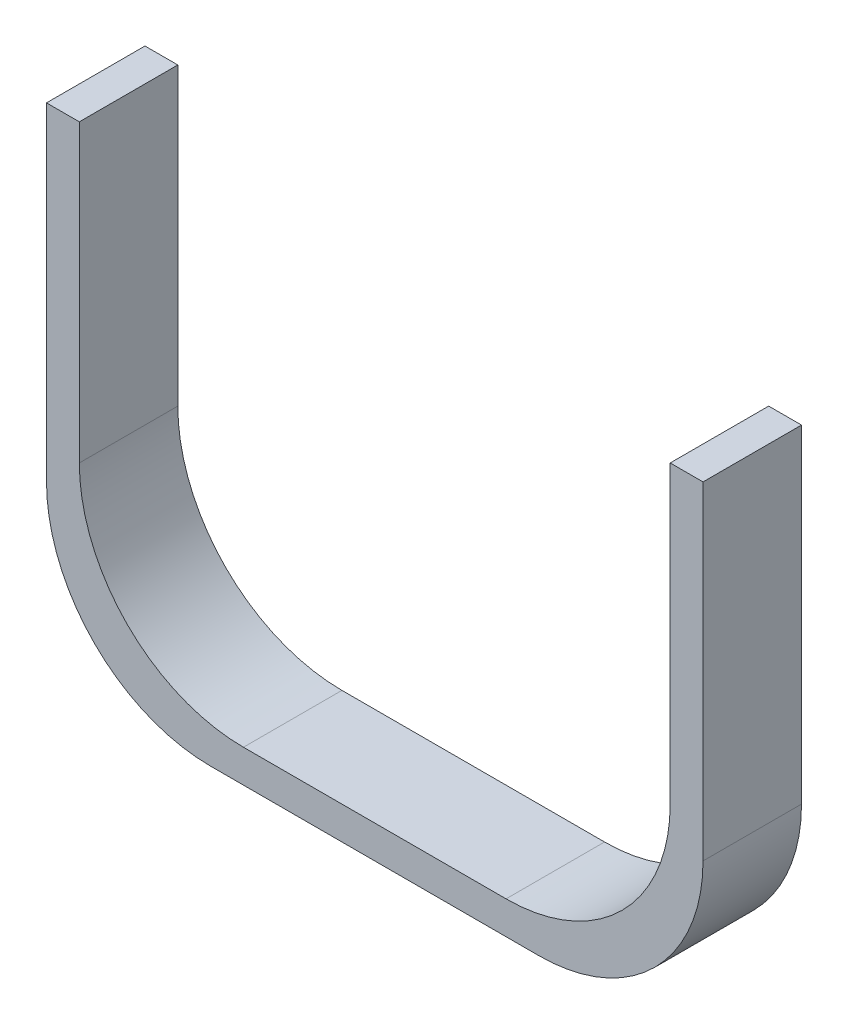
ISO-10303-21;
HEADER;
FILE_DESCRIPTION(('STEP AP214'),'2;1');
FILE_NAME('part.step','',(''),(''),'','','');
FILE_SCHEMA(('AUTOMOTIVE_DESIGN { 1 0 10303 214 1 1 1 1 }'));
ENDSEC;
DATA;
#1=APPLICATION_CONTEXT('core data for automotive mechanical design processes');
#2=APPLICATION_PROTOCOL_DEFINITION('international standard','automotive_design',2000,#1);
#3=PRODUCT_CONTEXT('',#1,'mechanical');
#4=PRODUCT('Part','Part','',(#3));
#5=PRODUCT_RELATED_PRODUCT_CATEGORY('part','',(#4));
#6=PRODUCT_DEFINITION_FORMATION('','',#4);
#7=PRODUCT_DEFINITION_CONTEXT('part definition',#1,'design');
#8=PRODUCT_DEFINITION('design','',#6,#7);
#9=PRODUCT_DEFINITION_SHAPE('','',#8);
#10=(LENGTH_UNIT() NAMED_UNIT(*) SI_UNIT(.MILLI.,.METRE.));
#11=(NAMED_UNIT(*) PLANE_ANGLE_UNIT() SI_UNIT($,.RADIAN.));
#12=(NAMED_UNIT(*) SI_UNIT($,.STERADIAN.) SOLID_ANGLE_UNIT());
#13=UNCERTAINTY_MEASURE_WITH_UNIT(LENGTH_MEASURE(1.E-05),#10,'distance_accuracy_value','');
#14=(GEOMETRIC_REPRESENTATION_CONTEXT(3) GLOBAL_UNCERTAINTY_ASSIGNED_CONTEXT((#13)) GLOBAL_UNIT_ASSIGNED_CONTEXT((#10,
#11,#12)) REPRESENTATION_CONTEXT('',''));
#15=CARTESIAN_POINT('',(0.,0.,0.));
#16=DIRECTION('',(0.,0.,1.));
#17=DIRECTION('',(1.,0.,0.));
#18=AXIS2_PLACEMENT_3D('',#15,#16,#17);
#19=CARTESIAN_POINT('',(0.,150.,30.));
#20=DIRECTION('',(1.,0.,0.));
#21=DIRECTION('',(0.,1.,0.));
#22=AXIS2_PLACEMENT_3D('',#19,#20,#21);
#23=PLANE('',#22);
#24=DIRECTION('',(0.,-1.,0.));
#25=VECTOR('',#24,1.);
#26=CARTESIAN_POINT('',(0.,150.,0.));
#27=LINE('',#26,#25);
#28=CARTESIAN_POINT('',(0.,150.,0.));
#29=VERTEX_POINT('',#28);
#30=CARTESIAN_POINT('',(0.,50.,0.));
#31=VERTEX_POINT('',#30);
#32=EDGE_CURVE('E165',#29,#31,#27,.T.);
#33=ORIENTED_EDGE('',*,*,#32,.T.);
#34=DIRECTION('',(0.,0.,-1.));
#35=VECTOR('',#34,1.);
#36=CARTESIAN_POINT('',(0.,50.,30.));
#37=LINE('',#36,#35);
#38=CARTESIAN_POINT('',(0.,50.,30.));
#39=VERTEX_POINT('',#38);
#40=EDGE_CURVE('E11',#31,#39,#37,.F.);
#41=ORIENTED_EDGE('',*,*,#40,.T.);
#42=DIRECTION('',(0.,-1.,0.));
#43=VECTOR('',#42,1.);
#44=CARTESIAN_POINT('',(0.,150.,30.));
#45=LINE('',#44,#43);
#46=CARTESIAN_POINT('',(0.,150.,30.));
#47=VERTEX_POINT('',#46);
#48=EDGE_CURVE('E182',#47,#39,#45,.T.);
#49=ORIENTED_EDGE('',*,*,#48,.F.);
#50=DIRECTION('',(0.,0.,-1.));
#51=VECTOR('',#50,1.);
#52=CARTESIAN_POINT('',(0.,150.,30.));
#53=LINE('',#52,#51);
#54=EDGE_CURVE('E164',#47,#29,#53,.T.);
#55=ORIENTED_EDGE('',*,*,#54,.T.);
#56=EDGE_LOOP('',(#33,#41,#49,#55));
#57=FACE_BOUND('',#56,.T.);
#58=ADVANCED_FACE('F36',(#57),#23,.F.);
#59=CARTESIAN_POINT('',(0.,0.,30.));
#60=DIRECTION('',(0.,1.,0.));
#61=DIRECTION('',(0.,0.,1.));
#62=AXIS2_PLACEMENT_3D('',#59,#60,#61);
#63=PLANE('',#62);
#64=DIRECTION('',(1.,0.,0.));
#65=VECTOR('',#64,1.);
#66=CARTESIAN_POINT('',(0.,0.,0.));
#67=LINE('',#66,#65);
#68=CARTESIAN_POINT('',(50.,0.,0.));
#69=VERTEX_POINT('',#68);
#70=CARTESIAN_POINT('',(150.,0.,0.));
#71=VERTEX_POINT('',#70);
#72=EDGE_CURVE('E167',#69,#71,#67,.T.);
#73=ORIENTED_EDGE('',*,*,#72,.T.);
#74=DIRECTION('',(0.,0.,-1.));
#75=VECTOR('',#74,1.);
#76=CARTESIAN_POINT('',(150.,0.,30.));
#77=LINE('',#76,#75);
#78=CARTESIAN_POINT('',(150.,0.,30.));
#79=VERTEX_POINT('',#78);
#80=EDGE_CURVE('E57',#71,#79,#77,.F.);
#81=ORIENTED_EDGE('',*,*,#80,.T.);
#82=DIRECTION('',(1.,0.,0.));
#83=VECTOR('',#82,1.);
#84=CARTESIAN_POINT('',(0.,0.,30.));
#85=LINE('',#84,#83);
#86=CARTESIAN_POINT('',(50.,0.,30.));
#87=VERTEX_POINT('',#86);
#88=EDGE_CURVE('E137',#87,#79,#85,.T.);
#89=ORIENTED_EDGE('',*,*,#88,.F.);
#90=DIRECTION('',(0.,0.,-1.));
#91=VECTOR('',#90,1.);
#92=CARTESIAN_POINT('',(50.,0.,30.));
#93=LINE('',#92,#91);
#94=EDGE_CURVE('E212',#87,#69,#93,.T.);
#95=ORIENTED_EDGE('',*,*,#94,.T.);
#96=EDGE_LOOP('',(#73,#81,#89,#95));
#97=FACE_BOUND('',#96,.T.);
#98=ADVANCED_FACE('F220',(#97),#63,.F.);
#99=CARTESIAN_POINT('',(200.,0.,30.));
#100=DIRECTION('',(-1.,0.,0.));
#101=DIRECTION('',(0.,0.,1.));
#102=AXIS2_PLACEMENT_3D('',#99,#100,#101);
#103=PLANE('',#102);
#104=DIRECTION('',(0.,1.,0.));
#105=VECTOR('',#104,1.);
#106=CARTESIAN_POINT('',(200.,0.,30.));
#107=LINE('',#106,#105);
#108=CARTESIAN_POINT('',(200.,50.,30.));
#109=VERTEX_POINT('',#108);
#110=CARTESIAN_POINT('',(200.,150.,30.));
#111=VERTEX_POINT('',#110);
#112=EDGE_CURVE('E126',#109,#111,#107,.T.);
#113=ORIENTED_EDGE('',*,*,#112,.F.);
#114=DIRECTION('',(0.,0.,-1.));
#115=VECTOR('',#114,1.);
#116=CARTESIAN_POINT('',(200.,50.,30.));
#117=LINE('',#116,#115);
#118=CARTESIAN_POINT('',(200.,50.,0.));
#119=VERTEX_POINT('',#118);
#120=EDGE_CURVE('E206',#109,#119,#117,.T.);
#121=ORIENTED_EDGE('',*,*,#120,.T.);
#122=DIRECTION('',(0.,1.,0.));
#123=VECTOR('',#122,1.);
#124=CARTESIAN_POINT('',(200.,0.,0.));
#125=LINE('',#124,#123);
#126=CARTESIAN_POINT('',(200.,150.,0.));
#127=VERTEX_POINT('',#126);
#128=EDGE_CURVE('E143',#119,#127,#125,.T.);
#129=ORIENTED_EDGE('',*,*,#128,.T.);
#130=DIRECTION('',(0.,0.,-1.));
#131=VECTOR('',#130,1.);
#132=CARTESIAN_POINT('',(200.,150.,30.));
#133=LINE('',#132,#131);
#134=EDGE_CURVE('E140',#111,#127,#133,.T.);
#135=ORIENTED_EDGE('',*,*,#134,.F.);
#136=EDGE_LOOP('',(#113,#121,#129,#135));
#137=FACE_BOUND('',#136,.T.);
#138=ADVANCED_FACE('F141',(#137),#103,.F.);
#139=CARTESIAN_POINT('',(200.,150.,30.));
#140=DIRECTION('',(0.,-1.,0.));
#141=DIRECTION('',(0.,0.,-1.));
#142=AXIS2_PLACEMENT_3D('',#139,#140,#141);
#143=PLANE('',#142);
#144=DIRECTION('',(-1.,0.,0.));
#145=VECTOR('',#144,1.);
#146=CARTESIAN_POINT('',(200.,150.,0.));
#147=LINE('',#146,#145);
#148=CARTESIAN_POINT('',(190.,150.,0.));
#149=VERTEX_POINT('',#148);
#150=EDGE_CURVE('E170',#127,#149,#147,.T.);
#151=ORIENTED_EDGE('',*,*,#150,.T.);
#152=DIRECTION('',(0.,0.,-1.));
#153=VECTOR('',#152,1.);
#154=CARTESIAN_POINT('',(190.,150.,30.));
#155=LINE('',#154,#153);
#156=CARTESIAN_POINT('',(190.,150.,30.));
#157=VERTEX_POINT('',#156);
#158=EDGE_CURVE('E147',#157,#149,#155,.T.);
#159=ORIENTED_EDGE('',*,*,#158,.F.);
#160=DIRECTION('',(-1.,0.,0.));
#161=VECTOR('',#160,1.);
#162=CARTESIAN_POINT('',(200.,150.,30.));
#163=LINE('',#162,#161);
#164=EDGE_CURVE('E131',#111,#157,#163,.T.);
#165=ORIENTED_EDGE('',*,*,#164,.F.);
#166=ORIENTED_EDGE('',*,*,#134,.T.);
#167=EDGE_LOOP('',(#151,#159,#165,#166));
#168=FACE_BOUND('',#167,.T.);
#169=ADVANCED_FACE('F149',(#168),#143,.F.);
#170=CARTESIAN_POINT('',(190.,150.,30.));
#171=DIRECTION('',(1.,0.,0.));
#172=DIRECTION('',(0.,1.,0.));
#173=AXIS2_PLACEMENT_3D('',#170,#171,#172);
#174=PLANE('',#173);
#175=DIRECTION('',(0.,-1.,0.));
#176=VECTOR('',#175,1.);
#177=CARTESIAN_POINT('',(190.,150.,0.));
#178=LINE('',#177,#176);
#179=CARTESIAN_POINT('',(190.,60.,0.));
#180=VERTEX_POINT('',#179);
#181=EDGE_CURVE('E172',#149,#180,#178,.T.);
#182=ORIENTED_EDGE('',*,*,#181,.T.);
#183=DIRECTION('',(0.,0.,-1.));
#184=VECTOR('',#183,1.);
#185=CARTESIAN_POINT('',(190.,60.,30.));
#186=LINE('',#185,#184);
#187=CARTESIAN_POINT('',(190.,60.,30.));
#188=VERTEX_POINT('',#187);
#189=EDGE_CURVE('E193',#180,#188,#186,.F.);
#190=ORIENTED_EDGE('',*,*,#189,.T.);
#191=DIRECTION('',(0.,-1.,0.));
#192=VECTOR('',#191,1.);
#193=CARTESIAN_POINT('',(190.,150.,30.));
#194=LINE('',#193,#192);
#195=EDGE_CURVE('E152',#157,#188,#194,.T.);
#196=ORIENTED_EDGE('',*,*,#195,.F.);
#197=ORIENTED_EDGE('',*,*,#158,.T.);
#198=EDGE_LOOP('',(#182,#190,#196,#197));
#199=FACE_BOUND('',#198,.T.);
#200=ADVANCED_FACE('F251',(#199),#174,.F.);
#201=CARTESIAN_POINT('',(190.,10.,30.));
#202=DIRECTION('',(0.,-1.,0.));
#203=DIRECTION('',(1.,0.,0.));
#204=AXIS2_PLACEMENT_3D('',#201,#202,#203);
#205=PLANE('',#204);
#206=DIRECTION('',(-1.,0.,0.));
#207=VECTOR('',#206,1.);
#208=CARTESIAN_POINT('',(190.,10.,30.));
#209=LINE('',#208,#207);
#210=CARTESIAN_POINT('',(140.,10.,30.));
#211=VERTEX_POINT('',#210);
#212=CARTESIAN_POINT('',(60.,9.99999999999999,30.));
#213=VERTEX_POINT('',#212);
#214=EDGE_CURVE('E154',#211,#213,#209,.T.);
#215=ORIENTED_EDGE('',*,*,#214,.F.);
#216=DIRECTION('',(0.,0.,-1.));
#217=VECTOR('',#216,1.);
#218=CARTESIAN_POINT('',(140.,10.,0.));
#219=LINE('',#218,#217);
#220=CARTESIAN_POINT('',(140.,10.,0.));
#221=VERTEX_POINT('',#220);
#222=EDGE_CURVE('E190',#211,#221,#219,.T.);
#223=ORIENTED_EDGE('',*,*,#222,.T.);
#224=DIRECTION('',(-1.,0.,0.));
#225=VECTOR('',#224,1.);
#226=CARTESIAN_POINT('',(190.,10.,0.));
#227=LINE('',#226,#225);
#228=CARTESIAN_POINT('',(60.,9.99999999999999,0.));
#229=VERTEX_POINT('',#228);
#230=EDGE_CURVE('E175',#221,#229,#227,.T.);
#231=ORIENTED_EDGE('',*,*,#230,.T.);
#232=DIRECTION('',(0.,0.,-1.));
#233=VECTOR('',#232,1.);
#234=CARTESIAN_POINT('',(60.,9.99999999999999,30.));
#235=LINE('',#234,#233);
#236=EDGE_CURVE('E146',#229,#213,#235,.F.);
#237=ORIENTED_EDGE('',*,*,#236,.T.);
#238=EDGE_LOOP('',(#215,#223,#231,#237));
#239=FACE_BOUND('',#238,.T.);
#240=ADVANCED_FACE('F243',(#239),#205,.F.);
#241=CARTESIAN_POINT('',(10.,9.99999999999998,30.));
#242=DIRECTION('',(-1.,0.,0.));
#243=DIRECTION('',(0.,0.,1.));
#244=AXIS2_PLACEMENT_3D('',#241,#242,#243);
#245=PLANE('',#244);
#246=DIRECTION('',(0.,1.,0.));
#247=VECTOR('',#246,1.);
#248=CARTESIAN_POINT('',(10.,9.99999999999998,30.));
#249=LINE('',#248,#247);
#250=CARTESIAN_POINT('',(10.,60.,30.));
#251=VERTEX_POINT('',#250);
#252=CARTESIAN_POINT('',(10.,150.,30.));
#253=VERTEX_POINT('',#252);
#254=EDGE_CURVE('E160',#251,#253,#249,.T.);
#255=ORIENTED_EDGE('',*,*,#254,.F.);
#256=DIRECTION('',(0.,0.,-1.));
#257=VECTOR('',#256,1.);
#258=CARTESIAN_POINT('',(10.,60.,0.));
#259=LINE('',#258,#257);
#260=CARTESIAN_POINT('',(10.,60.,0.));
#261=VERTEX_POINT('',#260);
#262=EDGE_CURVE('E195',#251,#261,#259,.T.);
#263=ORIENTED_EDGE('',*,*,#262,.T.);
#264=DIRECTION('',(0.,1.,0.));
#265=VECTOR('',#264,1.);
#266=CARTESIAN_POINT('',(10.,9.99999999999998,0.));
#267=LINE('',#266,#265);
#268=CARTESIAN_POINT('',(10.,150.,0.));
#269=VERTEX_POINT('',#268);
#270=EDGE_CURVE('E178',#261,#269,#267,.T.);
#271=ORIENTED_EDGE('',*,*,#270,.T.);
#272=DIRECTION('',(0.,0.,-1.));
#273=VECTOR('',#272,1.);
#274=CARTESIAN_POINT('',(10.,150.,30.));
#275=LINE('',#274,#273);
#276=EDGE_CURVE('E185',#253,#269,#275,.T.);
#277=ORIENTED_EDGE('',*,*,#276,.F.);
#278=EDGE_LOOP('',(#255,#263,#271,#277));
#279=FACE_BOUND('',#278,.T.);
#280=ADVANCED_FACE('F235',(#279),#245,.F.);
#281=CARTESIAN_POINT('',(10.,150.,30.));
#282=DIRECTION('',(0.,-1.,0.));
#283=DIRECTION('',(0.,0.,-1.));
#284=AXIS2_PLACEMENT_3D('',#281,#282,#283);
#285=PLANE('',#284);
#286=DIRECTION('',(-1.,0.,0.));
#287=VECTOR('',#286,1.);
#288=CARTESIAN_POINT('',(10.,150.,0.));
#289=LINE('',#288,#287);
#290=EDGE_CURVE('E180',#269,#29,#289,.T.);
#291=ORIENTED_EDGE('',*,*,#290,.T.);
#292=ORIENTED_EDGE('',*,*,#54,.F.);
#293=DIRECTION('',(-1.,0.,0.));
#294=VECTOR('',#293,1.);
#295=CARTESIAN_POINT('',(10.,150.,30.));
#296=LINE('',#295,#294);
#297=EDGE_CURVE('E162',#253,#47,#296,.T.);
#298=ORIENTED_EDGE('',*,*,#297,.F.);
#299=ORIENTED_EDGE('',*,*,#276,.T.);
#300=EDGE_LOOP('',(#291,#292,#298,#299));
#301=FACE_BOUND('',#300,.T.);
#302=ADVANCED_FACE('F229',(#301),#285,.F.);
#303=CARTESIAN_POINT('',(0.,0.,30.));
#304=DIRECTION('',(0.,0.,1.));
#305=DIRECTION('',(1.,0.,0.));
#306=AXIS2_PLACEMENT_3D('',#303,#304,#305);
#307=PLANE('',#306);
#308=ORIENTED_EDGE('',*,*,#88,.T.);
#309=CARTESIAN_POINT('',(150.,50.,30.));
#310=DIRECTION('',(0.,0.,1.));
#311=DIRECTION('',(1.,0.,0.));
#312=AXIS2_PLACEMENT_3D('',#309,#310,#311);
#313=CIRCLE('',#312,50.);
#314=EDGE_CURVE('E44',#79,#109,#313,.T.);
#315=ORIENTED_EDGE('',*,*,#314,.T.);
#316=ORIENTED_EDGE('',*,*,#112,.T.);
#317=ORIENTED_EDGE('',*,*,#164,.T.);
#318=ORIENTED_EDGE('',*,*,#195,.T.);
#319=CARTESIAN_POINT('',(140.,60.,30.));
#320=DIRECTION('',(0.,0.,1.));
#321=DIRECTION('',(1.,0.,0.));
#322=AXIS2_PLACEMENT_3D('',#319,#320,#321);
#323=CIRCLE('',#322,50.);
#324=EDGE_CURVE('E200',#188,#211,#323,.F.);
#325=ORIENTED_EDGE('',*,*,#324,.T.);
#326=ORIENTED_EDGE('',*,*,#214,.T.);
#327=CARTESIAN_POINT('',(60.,60.,30.));
#328=DIRECTION('',(0.,0.,1.));
#329=DIRECTION('',(1.,0.,0.));
#330=AXIS2_PLACEMENT_3D('',#327,#328,#329);
#331=CIRCLE('',#330,50.);
#332=EDGE_CURVE('E204',#213,#251,#331,.F.);
#333=ORIENTED_EDGE('',*,*,#332,.T.);
#334=ORIENTED_EDGE('',*,*,#254,.T.);
#335=ORIENTED_EDGE('',*,*,#297,.T.);
#336=ORIENTED_EDGE('',*,*,#48,.T.);
#337=CARTESIAN_POINT('',(50.,50.,30.));
#338=DIRECTION('',(0.,0.,1.));
#339=DIRECTION('',(1.,0.,0.));
#340=AXIS2_PLACEMENT_3D('',#337,#338,#339);
#341=CIRCLE('',#340,50.);
#342=EDGE_CURVE('E216',#39,#87,#341,.T.);
#343=ORIENTED_EDGE('',*,*,#342,.T.);
#344=EDGE_LOOP('',(#308,#315,#316,#317,#318,#325,#326,#333,#334,#335,#336,#343));
#345=FACE_BOUND('',#344,.T.);
#346=ADVANCED_FACE('F128',(#345),#307,.T.);
#347=CARTESIAN_POINT('',(0.,0.,0.));
#348=DIRECTION('',(0.,0.,1.));
#349=DIRECTION('',(1.,0.,0.));
#350=AXIS2_PLACEMENT_3D('',#347,#348,#349);
#351=PLANE('',#350);
#352=ORIENTED_EDGE('',*,*,#128,.F.);
#353=CARTESIAN_POINT('',(150.,50.,0.));
#354=DIRECTION('',(0.,0.,1.));
#355=DIRECTION('',(1.,0.,0.));
#356=AXIS2_PLACEMENT_3D('',#353,#354,#355);
#357=CIRCLE('',#356,50.);
#358=EDGE_CURVE('E210',#119,#71,#357,.F.);
#359=ORIENTED_EDGE('',*,*,#358,.T.);
#360=ORIENTED_EDGE('',*,*,#72,.F.);
#361=CARTESIAN_POINT('',(50.,50.,0.));
#362=DIRECTION('',(0.,0.,1.));
#363=DIRECTION('',(1.,0.,0.));
#364=AXIS2_PLACEMENT_3D('',#361,#362,#363);
#365=CIRCLE('',#364,50.);
#366=EDGE_CURVE('E208',#69,#31,#365,.F.);
#367=ORIENTED_EDGE('',*,*,#366,.T.);
#368=ORIENTED_EDGE('',*,*,#32,.F.);
#369=ORIENTED_EDGE('',*,*,#290,.F.);
#370=ORIENTED_EDGE('',*,*,#270,.F.);
#371=CARTESIAN_POINT('',(60.,60.,0.));
#372=DIRECTION('',(0.,0.,1.));
#373=DIRECTION('',(1.,0.,0.));
#374=AXIS2_PLACEMENT_3D('',#371,#372,#373);
#375=CIRCLE('',#374,50.);
#376=EDGE_CURVE('E202',#261,#229,#375,.T.);
#377=ORIENTED_EDGE('',*,*,#376,.T.);
#378=ORIENTED_EDGE('',*,*,#230,.F.);
#379=CARTESIAN_POINT('',(140.,60.,0.));
#380=DIRECTION('',(0.,0.,1.));
#381=DIRECTION('',(1.,0.,0.));
#382=AXIS2_PLACEMENT_3D('',#379,#380,#381);
#383=CIRCLE('',#382,50.);
#384=EDGE_CURVE('E198',#221,#180,#383,.T.);
#385=ORIENTED_EDGE('',*,*,#384,.T.);
#386=ORIENTED_EDGE('',*,*,#181,.F.);
#387=ORIENTED_EDGE('',*,*,#150,.F.);
#388=EDGE_LOOP('',(#352,#359,#360,#367,#368,#369,#370,#377,#378,#385,#386,#387));
#389=FACE_BOUND('',#388,.T.);
#390=ADVANCED_FACE('F224',(#389),#351,.F.);
#391=CARTESIAN_POINT('',(140.,60.,30.));
#392=DIRECTION('',(0.,0.,1.));
#393=DIRECTION('',(1.,0.,0.));
#394=AXIS2_PLACEMENT_3D('',#391,#392,#393);
#395=CYLINDRICAL_SURFACE('',#394,50.);
#396=ORIENTED_EDGE('',*,*,#324,.F.);
#397=ORIENTED_EDGE('',*,*,#189,.F.);
#398=ORIENTED_EDGE('',*,*,#384,.F.);
#399=ORIENTED_EDGE('',*,*,#222,.F.);
#400=EDGE_LOOP('',(#396,#397,#398,#399));
#401=FACE_BOUND('',#400,.T.);
#402=ADVANCED_FACE('F248',(#401),#395,.F.);
#403=CARTESIAN_POINT('',(60.,60.,30.));
#404=DIRECTION('',(0.,0.,1.));
#405=DIRECTION('',(1.,0.,0.));
#406=AXIS2_PLACEMENT_3D('',#403,#404,#405);
#407=CYLINDRICAL_SURFACE('',#406,50.);
#408=ORIENTED_EDGE('',*,*,#332,.F.);
#409=ORIENTED_EDGE('',*,*,#236,.F.);
#410=ORIENTED_EDGE('',*,*,#376,.F.);
#411=ORIENTED_EDGE('',*,*,#262,.F.);
#412=EDGE_LOOP('',(#408,#409,#410,#411));
#413=FACE_BOUND('',#412,.T.);
#414=ADVANCED_FACE('F239',(#413),#407,.F.);
#415=CARTESIAN_POINT('',(150.,50.,30.));
#416=DIRECTION('',(0.,0.,-1.));
#417=DIRECTION('',(-1.,0.,0.));
#418=AXIS2_PLACEMENT_3D('',#415,#416,#417);
#419=CYLINDRICAL_SURFACE('',#418,50.);
#420=ORIENTED_EDGE('',*,*,#314,.F.);
#421=ORIENTED_EDGE('',*,*,#80,.F.);
#422=ORIENTED_EDGE('',*,*,#358,.F.);
#423=ORIENTED_EDGE('',*,*,#120,.F.);
#424=EDGE_LOOP('',(#420,#421,#422,#423));
#425=FACE_BOUND('',#424,.T.);
#426=ADVANCED_FACE('F271',(#425),#419,.T.);
#427=CARTESIAN_POINT('',(50.,50.,30.));
#428=DIRECTION('',(0.,0.,-1.));
#429=DIRECTION('',(-1.,0.,0.));
#430=AXIS2_PLACEMENT_3D('',#427,#428,#429);
#431=CYLINDRICAL_SURFACE('',#430,50.);
#432=ORIENTED_EDGE('',*,*,#342,.F.);
#433=ORIENTED_EDGE('',*,*,#40,.F.);
#434=ORIENTED_EDGE('',*,*,#366,.F.);
#435=ORIENTED_EDGE('',*,*,#94,.F.);
#436=EDGE_LOOP('',(#432,#433,#434,#435));
#437=FACE_BOUND('',#436,.T.);
#438=ADVANCED_FACE('F38',(#437),#431,.T.);
#439=CLOSED_SHELL('',(#58,#98,#138,#169,#200,#240,#280,#302,#346,#390,#402,#414,#426,#438));
#440=MANIFOLD_SOLID_BREP('B2',#439);
#441=ADVANCED_BREP_SHAPE_REPRESENTATION('',(#18,#440),#14);
#442=SHAPE_DEFINITION_REPRESENTATION(#9,#441);
ENDSEC;
END-ISO-10303-21;
